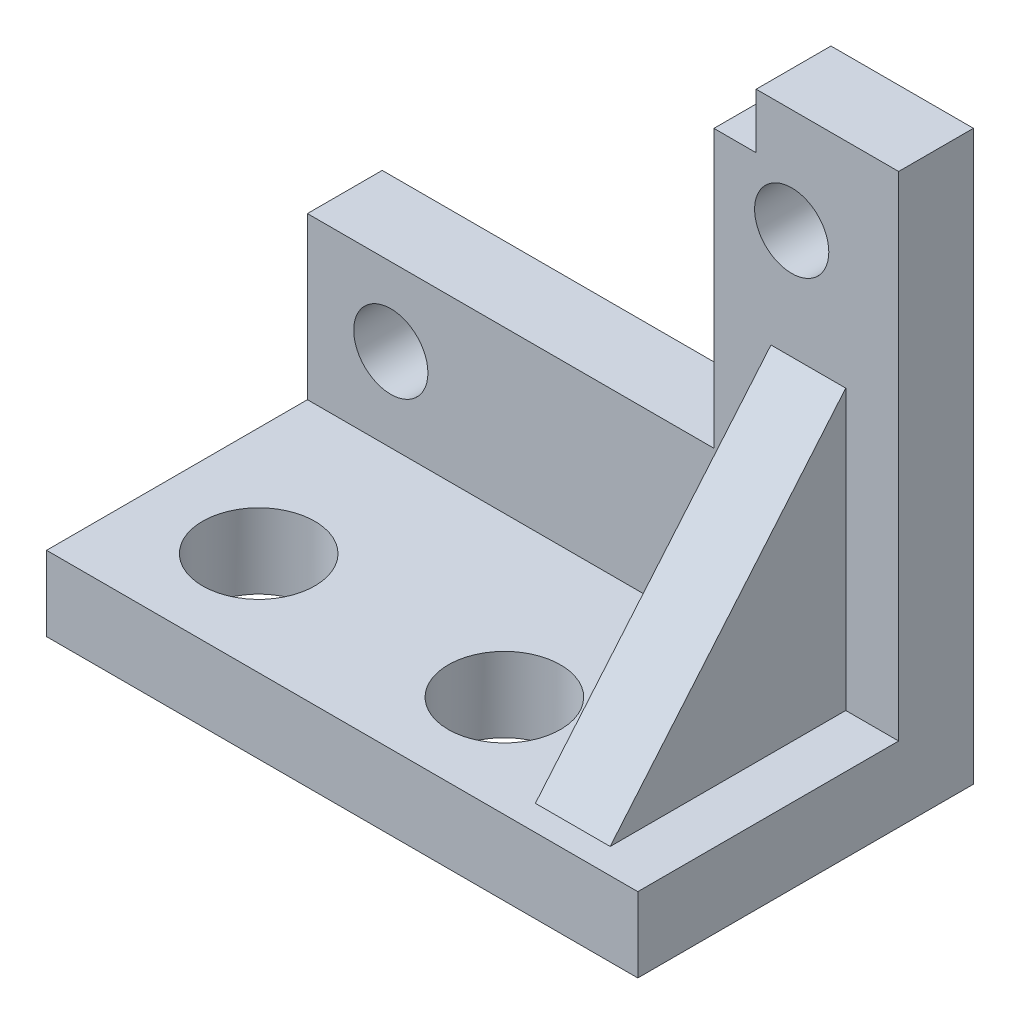
ISO-10303-21;
HEADER;
FILE_DESCRIPTION(('STEP AP214'),'2;1');
FILE_NAME('part.step','',(''),(''),'','','');
FILE_SCHEMA(('AUTOMOTIVE_DESIGN { 1 0 10303 214 1 1 1 1 }'));
ENDSEC;
DATA;
#1=APPLICATION_CONTEXT('core data for automotive mechanical design processes');
#2=APPLICATION_PROTOCOL_DEFINITION('international standard','automotive_design',2000,#1);
#3=PRODUCT_CONTEXT('',#1,'mechanical');
#4=PRODUCT('Part','Part','',(#3));
#5=PRODUCT_RELATED_PRODUCT_CATEGORY('part','',(#4));
#6=PRODUCT_DEFINITION_FORMATION('','',#4);
#7=PRODUCT_DEFINITION_CONTEXT('part definition',#1,'design');
#8=PRODUCT_DEFINITION('design','',#6,#7);
#9=PRODUCT_DEFINITION_SHAPE('','',#8);
#10=(LENGTH_UNIT() NAMED_UNIT(*) SI_UNIT(.MILLI.,.METRE.));
#11=(NAMED_UNIT(*) PLANE_ANGLE_UNIT() SI_UNIT($,.RADIAN.));
#12=(NAMED_UNIT(*) SI_UNIT($,.STERADIAN.) SOLID_ANGLE_UNIT());
#13=UNCERTAINTY_MEASURE_WITH_UNIT(LENGTH_MEASURE(1.E-05),#10,'distance_accuracy_value','');
#14=(GEOMETRIC_REPRESENTATION_CONTEXT(3) GLOBAL_UNCERTAINTY_ASSIGNED_CONTEXT((#13)) GLOBAL_UNIT_ASSIGNED_CONTEXT((#10,
#11,#12)) REPRESENTATION_CONTEXT('',''));
#15=CARTESIAN_POINT('',(0.,0.,0.));
#16=DIRECTION('',(0.,0.,1.));
#17=DIRECTION('',(1.,0.,0.));
#18=AXIS2_PLACEMENT_3D('',#15,#16,#17);
#19=CARTESIAN_POINT('',(12.2372138290052,-8.28040490381666,19.05));
#20=DIRECTION('',(0.,1.,0.));
#21=DIRECTION('',(0.,0.,1.));
#22=AXIS2_PLACEMENT_3D('',#19,#20,#21);
#23=PLANE('',#22);
#24=CARTESIAN_POINT('',(2.25586703304267,-8.28040490381666,9.93045378198823));
#25=DIRECTION('',(0.,1.,0.));
#26=DIRECTION('',(0.,0.,1.));
#27=AXIS2_PLACEMENT_3D('',#24,#25,#26);
#28=CIRCLE('',#27,2.38125);
#29=CARTESIAN_POINT('',(2.25586703304267,-8.28040490381666,12.3117037819882));
#30=VERTEX_POINT('',#29);
#31=EDGE_CURVE('E211',#30,#30,#28,.T.);
#32=ORIENTED_EDGE('',*,*,#31,.F.);
#33=EDGE_LOOP('',(#32));
#34=FACE_BOUND('',#33,.T.);
#35=CARTESIAN_POINT('',(-8.23667785925595,-8.28040490381666,9.86728065063617));
#36=DIRECTION('',(0.,1.,0.));
#37=DIRECTION('',(0.,0.,1.));
#38=AXIS2_PLACEMENT_3D('',#35,#36,#37);
#39=CIRCLE('',#38,2.38125);
#40=CARTESIAN_POINT('',(-8.23667785925595,-8.28040490381666,12.2485306506362));
#41=VERTEX_POINT('',#40);
#42=EDGE_CURVE('E202',#41,#41,#39,.T.);
#43=ORIENTED_EDGE('',*,*,#42,.F.);
#44=EDGE_LOOP('',(#43));
#45=FACE_BOUND('',#44,.T.);
#46=DIRECTION('',(0.,0.,1.));
#47=VECTOR('',#46,1.);
#48=CARTESIAN_POINT('',(-12.8607861709948,-8.28040490381666,0.));
#49=LINE('',#48,#47);
#50=CARTESIAN_POINT('',(-12.8607861709948,-8.28040490381666,3.175));
#51=VERTEX_POINT('',#50);
#52=CARTESIAN_POINT('',(-12.8607861709948,-8.28040490381666,14.2485306506362));
#53=VERTEX_POINT('',#52);
#54=EDGE_CURVE('E210',#51,#53,#49,.T.);
#55=ORIENTED_EDGE('',*,*,#54,.T.);
#56=DIRECTION('',(1.,0.,0.));
#57=VECTOR('',#56,1.);
#58=CARTESIAN_POINT('',(0.,-8.28040490381666,14.2485306506362));
#59=LINE('',#58,#57);
#60=CARTESIAN_POINT('',(12.2372138290052,-8.28040490381666,14.2485306506362));
#61=VERTEX_POINT('',#60);
#62=EDGE_CURVE('E118',#53,#61,#59,.T.);
#63=ORIENTED_EDGE('',*,*,#62,.T.);
#64=DIRECTION('',(0.,0.,-1.));
#65=VECTOR('',#64,1.);
#66=CARTESIAN_POINT('',(12.2372138290052,-8.28040490381666,19.05));
#67=LINE('',#66,#65);
#68=CARTESIAN_POINT('',(12.2372138290052,-8.28040490381666,3.175));
#69=VERTEX_POINT('',#68);
#70=EDGE_CURVE('E207',#61,#69,#67,.T.);
#71=ORIENTED_EDGE('',*,*,#70,.T.);
#72=DIRECTION('',(1.,0.,0.));
#73=VECTOR('',#72,1.);
#74=CARTESIAN_POINT('',(-11.8607861709948,-8.28040490381666,3.175));
#75=LINE('',#74,#73);
#76=CARTESIAN_POINT('',(9.99150883570193,-8.28040490381666,3.175));
#77=VERTEX_POINT('',#76);
#78=EDGE_CURVE('E239',#77,#69,#75,.T.);
#79=ORIENTED_EDGE('',*,*,#78,.F.);
#80=DIRECTION('',(0.,0.,-1.));
#81=VECTOR('',#80,1.);
#82=CARTESIAN_POINT('',(9.99150883570193,-8.28040490381666,13.175));
#83=LINE('',#82,#81);
#84=CARTESIAN_POINT('',(9.99150883570193,-8.28040490381666,13.175));
#85=VERTEX_POINT('',#84);
#86=EDGE_CURVE('E298',#85,#77,#83,.T.);
#87=ORIENTED_EDGE('',*,*,#86,.F.);
#88=DIRECTION('',(1.,0.,0.));
#89=VECTOR('',#88,1.);
#90=CARTESIAN_POINT('',(6.81650883570193,-8.28040490381666,13.175));
#91=LINE('',#90,#89);
#92=CARTESIAN_POINT('',(6.81650883570193,-8.28040490381666,13.175));
#93=VERTEX_POINT('',#92);
#94=EDGE_CURVE('E296',#93,#85,#91,.T.);
#95=ORIENTED_EDGE('',*,*,#94,.F.);
#96=DIRECTION('',(0.,0.,-1.));
#97=VECTOR('',#96,1.);
#98=CARTESIAN_POINT('',(6.81650883570193,-8.28040490381666,13.175));
#99=LINE('',#98,#97);
#100=CARTESIAN_POINT('',(6.81650883570193,-8.28040490381666,3.175));
#101=VERTEX_POINT('',#100);
#102=EDGE_CURVE('E308',#93,#101,#99,.T.);
#103=ORIENTED_EDGE('',*,*,#102,.T.);
#104=EDGE_CURVE('E236',#51,#101,#75,.T.);
#105=ORIENTED_EDGE('',*,*,#104,.F.);
#106=EDGE_LOOP('',(#55,#63,#71,#79,#87,#95,#103,#105));
#107=FACE_BOUND('',#106,.T.);
#108=ADVANCED_FACE('F101',(#34,#45,#107),#23,.T.);
#109=CARTESIAN_POINT('',(12.2372138290052,-8.28040490381666,3.175));
#110=DIRECTION('',(-1.,0.,0.));
#111=DIRECTION('',(0.,0.,1.));
#112=AXIS2_PLACEMENT_3D('',#109,#110,#111);
#113=PLANE('',#112);
#114=DIRECTION('',(0.,1.,0.));
#115=VECTOR('',#114,1.);
#116=CARTESIAN_POINT('',(12.2372138290052,-18.2804049038167,14.2485306506362));
#117=LINE('',#116,#115);
#118=CARTESIAN_POINT('',(12.2372138290052,-11.4554049038167,14.2485306506362));
#119=VERTEX_POINT('',#118);
#120=EDGE_CURVE('E195',#119,#61,#117,.T.);
#121=ORIENTED_EDGE('',*,*,#120,.F.);
#122=DIRECTION('',(0.,0.,-1.));
#123=VECTOR('',#122,1.);
#124=CARTESIAN_POINT('',(12.2372138290052,-11.4554049038167,19.05));
#125=LINE('',#124,#123);
#126=CARTESIAN_POINT('',(12.2372138290052,-11.4554049038167,0.));
#127=VERTEX_POINT('',#126);
#128=EDGE_CURVE('E217',#119,#127,#125,.T.);
#129=ORIENTED_EDGE('',*,*,#128,.T.);
#130=DIRECTION('',(0.,1.,0.));
#131=VECTOR('',#130,1.);
#132=CARTESIAN_POINT('',(12.2372138290052,-8.28040490381666,0.));
#133=LINE('',#132,#131);
#134=CARTESIAN_POINT('',(12.2372138290052,12.6585950961833,0.));
#135=VERTEX_POINT('',#134);
#136=EDGE_CURVE('E233',#127,#135,#133,.T.);
#137=ORIENTED_EDGE('',*,*,#136,.T.);
#138=DIRECTION('',(0.,0.,-1.));
#139=VECTOR('',#138,1.);
#140=CARTESIAN_POINT('',(12.2372138290052,12.6585950961833,3.175));
#141=LINE('',#140,#139);
#142=CARTESIAN_POINT('',(12.2372138290052,12.6585950961833,3.175));
#143=VERTEX_POINT('',#142);
#144=EDGE_CURVE('E110',#143,#135,#141,.T.);
#145=ORIENTED_EDGE('',*,*,#144,.F.);
#146=DIRECTION('',(0.,1.,0.));
#147=VECTOR('',#146,1.);
#148=CARTESIAN_POINT('',(12.2372138290052,-8.28040490381666,3.175));
#149=LINE('',#148,#147);
#150=EDGE_CURVE('E215',#69,#143,#149,.T.);
#151=ORIENTED_EDGE('',*,*,#150,.F.);
#152=ORIENTED_EDGE('',*,*,#70,.F.);
#153=EDGE_LOOP('',(#121,#129,#137,#145,#151,#152));
#154=FACE_BOUND('',#153,.T.);
#155=ADVANCED_FACE('F103',(#154),#113,.F.);
#156=CARTESIAN_POINT('',(12.2372138290052,-11.4554049038167,19.05));
#157=DIRECTION('',(0.,-1.,0.));
#158=DIRECTION('',(0.,0.,-1.));
#159=AXIS2_PLACEMENT_3D('',#156,#157,#158);
#160=PLANE('',#159);
#161=CARTESIAN_POINT('',(2.25586703304267,-11.4554049038167,9.93045378198823));
#162=DIRECTION('',(0.,-1.,0.));
#163=DIRECTION('',(0.,0.,-1.));
#164=AXIS2_PLACEMENT_3D('',#161,#162,#163);
#165=CIRCLE('',#164,2.38125);
#166=CARTESIAN_POINT('',(2.25586703304267,-11.4554049038167,7.54920378198822));
#167=VERTEX_POINT('',#166);
#168=EDGE_CURVE('E105',#167,#167,#165,.T.);
#169=ORIENTED_EDGE('',*,*,#168,.F.);
#170=EDGE_LOOP('',(#169));
#171=FACE_BOUND('',#170,.T.);
#172=CARTESIAN_POINT('',(-8.23667785925595,-11.4554049038167,9.86728065063617));
#173=DIRECTION('',(0.,-1.,0.));
#174=DIRECTION('',(0.,0.,-1.));
#175=AXIS2_PLACEMENT_3D('',#172,#173,#174);
#176=CIRCLE('',#175,2.38125);
#177=CARTESIAN_POINT('',(-8.23667785925595,-11.4554049038167,7.48603065063617));
#178=VERTEX_POINT('',#177);
#179=EDGE_CURVE('E279',#178,#178,#176,.T.);
#180=ORIENTED_EDGE('',*,*,#179,.F.);
#181=EDGE_LOOP('',(#180));
#182=FACE_BOUND('',#181,.T.);
#183=ORIENTED_EDGE('',*,*,#128,.F.);
#184=DIRECTION('',(-1.,0.,0.));
#185=VECTOR('',#184,1.);
#186=CARTESIAN_POINT('',(12.2372138290052,-11.4554049038167,14.2485306506362));
#187=LINE('',#186,#185);
#188=CARTESIAN_POINT('',(-12.8607861709948,-11.4554049038167,14.2485306506362));
#189=VERTEX_POINT('',#188);
#190=EDGE_CURVE('E198',#119,#189,#187,.T.);
#191=ORIENTED_EDGE('',*,*,#190,.T.);
#192=DIRECTION('',(0.,0.,1.));
#193=VECTOR('',#192,1.);
#194=CARTESIAN_POINT('',(-12.8607861709948,-11.4554049038167,0.));
#195=LINE('',#194,#193);
#196=CARTESIAN_POINT('',(-12.8607861709948,-11.4554049038167,0.));
#197=VERTEX_POINT('',#196);
#198=EDGE_CURVE('E310',#197,#189,#195,.T.);
#199=ORIENTED_EDGE('',*,*,#198,.F.);
#200=DIRECTION('',(-1.,0.,0.));
#201=VECTOR('',#200,1.);
#202=CARTESIAN_POINT('',(12.2372138290052,-11.4554049038167,0.));
#203=LINE('',#202,#201);
#204=EDGE_CURVE('E222',#127,#197,#203,.T.);
#205=ORIENTED_EDGE('',*,*,#204,.F.);
#206=EDGE_LOOP('',(#183,#191,#199,#205));
#207=FACE_BOUND('',#206,.T.);
#208=ADVANCED_FACE('F333',(#171,#182,#207),#160,.T.);
#209=CARTESIAN_POINT('',(-12.8607861709948,-1.43840490381666,0.));
#210=DIRECTION('',(-1.,0.,0.));
#211=DIRECTION('',(0.,-1.,0.));
#212=AXIS2_PLACEMENT_3D('',#209,#210,#211);
#213=PLANE('',#212);
#214=ORIENTED_EDGE('',*,*,#198,.T.);
#215=DIRECTION('',(0.,1.,0.));
#216=VECTOR('',#215,1.);
#217=CARTESIAN_POINT('',(-12.8607861709948,-1.43840490381666,14.2485306506362));
#218=LINE('',#217,#216);
#219=EDGE_CURVE('E12',#189,#53,#218,.T.);
#220=ORIENTED_EDGE('',*,*,#219,.T.);
#221=ORIENTED_EDGE('',*,*,#54,.F.);
#222=DIRECTION('',(0.,-1.,0.));
#223=VECTOR('',#222,1.);
#224=CARTESIAN_POINT('',(-12.8607861709948,-1.43840490381666,3.175));
#225=LINE('',#224,#223);
#226=CARTESIAN_POINT('',(-12.8607861709948,-1.43840490381666,3.175));
#227=VERTEX_POINT('',#226);
#228=EDGE_CURVE('E312',#227,#51,#225,.T.);
#229=ORIENTED_EDGE('',*,*,#228,.F.);
#230=DIRECTION('',(0.,0.,1.));
#231=VECTOR('',#230,1.);
#232=CARTESIAN_POINT('',(-12.8607861709948,-1.43840490381666,0.));
#233=LINE('',#232,#231);
#234=CARTESIAN_POINT('',(-12.8607861709948,-1.43840490381666,0.));
#235=VERTEX_POINT('',#234);
#236=EDGE_CURVE('E317',#235,#227,#233,.T.);
#237=ORIENTED_EDGE('',*,*,#236,.F.);
#238=DIRECTION('',(0.,-1.,0.));
#239=VECTOR('',#238,1.);
#240=CARTESIAN_POINT('',(-12.8607861709948,-1.43840490381666,0.));
#241=LINE('',#240,#239);
#242=EDGE_CURVE('E314',#235,#197,#241,.T.);
#243=ORIENTED_EDGE('',*,*,#242,.T.);
#244=EDGE_LOOP('',(#214,#220,#221,#229,#237,#243));
#245=FACE_BOUND('',#244,.T.);
#246=ADVANCED_FACE('F332',(#245),#213,.T.);
#247=CARTESIAN_POINT('',(0.,0.,3.175));
#248=DIRECTION('',(0.,0.,1.));
#249=DIRECTION('',(1.,0.,0.));
#250=AXIS2_PLACEMENT_3D('',#247,#248,#249);
#251=PLANE('',#250);
#252=DIRECTION('',(0.,-1.,0.));
#253=VECTOR('',#252,1.);
#254=CARTESIAN_POINT('',(6.81650883570193,3.57002461571214,3.175));
#255=LINE('',#254,#253);
#256=CARTESIAN_POINT('',(6.81650883570193,3.57002461571214,3.175));
#257=VERTEX_POINT('',#256);
#258=EDGE_CURVE('E295',#257,#101,#255,.T.);
#259=ORIENTED_EDGE('',*,*,#258,.F.);
#260=DIRECTION('',(-1.,0.,0.));
#261=VECTOR('',#260,1.);
#262=CARTESIAN_POINT('',(9.99150883570193,3.57002461571214,3.175));
#263=LINE('',#262,#261);
#264=CARTESIAN_POINT('',(9.99150883570193,3.57002461571214,3.175));
#265=VERTEX_POINT('',#264);
#266=EDGE_CURVE('E299',#265,#257,#263,.T.);
#267=ORIENTED_EDGE('',*,*,#266,.F.);
#268=DIRECTION('',(0.,1.,0.));
#269=VECTOR('',#268,1.);
#270=CARTESIAN_POINT('',(9.99150883570193,-8.28040490381666,3.175));
#271=LINE('',#270,#269);
#272=EDGE_CURVE('E302',#77,#265,#271,.T.);
#273=ORIENTED_EDGE('',*,*,#272,.F.);
#274=ORIENTED_EDGE('',*,*,#78,.T.);
#275=ORIENTED_EDGE('',*,*,#150,.T.);
#276=DIRECTION('',(-1.,0.,0.));
#277=VECTOR('',#276,1.);
#278=CARTESIAN_POINT('',(12.2372138290052,12.6585950961833,3.175));
#279=LINE('',#278,#277);
#280=CARTESIAN_POINT('',(6.18817038186677,12.6585950961833,3.175));
#281=VERTEX_POINT('',#280);
#282=EDGE_CURVE('E241',#143,#281,#279,.T.);
#283=ORIENTED_EDGE('',*,*,#282,.T.);
#284=DIRECTION('',(0.,1.,0.));
#285=VECTOR('',#284,1.);
#286=CARTESIAN_POINT('',(6.18817038186677,10.3218119533511,3.175));
#287=LINE('',#286,#285);
#288=CARTESIAN_POINT('',(6.18817038186677,10.3218119533511,3.175));
#289=VERTEX_POINT('',#288);
#290=EDGE_CURVE('E243',#289,#281,#287,.T.);
#291=ORIENTED_EDGE('',*,*,#290,.F.);
#292=DIRECTION('',(1.,0.,0.));
#293=VECTOR('',#292,1.);
#294=CARTESIAN_POINT('',(4.39521382900517,10.3218119533511,3.175));
#295=LINE('',#294,#293);
#296=CARTESIAN_POINT('',(4.39521382900517,10.3218119533511,3.175));
#297=VERTEX_POINT('',#296);
#298=EDGE_CURVE('E246',#297,#289,#295,.T.);
#299=ORIENTED_EDGE('',*,*,#298,.F.);
#300=DIRECTION('',(0.,-1.,0.));
#301=VECTOR('',#300,1.);
#302=CARTESIAN_POINT('',(4.39521382900517,10.3218119533511,3.175));
#303=LINE('',#302,#301);
#304=CARTESIAN_POINT('',(4.39521382900517,-1.43840490381666,3.175));
#305=VERTEX_POINT('',#304);
#306=EDGE_CURVE('E249',#297,#305,#303,.T.);
#307=ORIENTED_EDGE('',*,*,#306,.T.);
#308=DIRECTION('',(-1.,0.,0.));
#309=VECTOR('',#308,1.);
#310=CARTESIAN_POINT('',(4.39521382900517,-1.43840490381666,3.175));
#311=LINE('',#310,#309);
#312=EDGE_CURVE('E251',#305,#227,#311,.T.);
#313=ORIENTED_EDGE('',*,*,#312,.T.);
#314=ORIENTED_EDGE('',*,*,#228,.T.);
#315=ORIENTED_EDGE('',*,*,#104,.T.);
#316=EDGE_LOOP('',(#259,#267,#273,#274,#275,#283,#291,#299,#307,#313,#314,#315));
#317=FACE_BOUND('',#316,.T.);
#318=CARTESIAN_POINT('',(-9.32078617099483,-4.74040490381666,3.175));
#319=DIRECTION('',(0.,0.,1.));
#320=DIRECTION('',(1.,0.,0.));
#321=AXIS2_PLACEMENT_3D('',#318,#319,#320);
#322=CIRCLE('',#321,1.5748);
#323=CARTESIAN_POINT('',(-7.74598617099483,-4.74040490381666,3.175));
#324=VERTEX_POINT('',#323);
#325=EDGE_CURVE('E220',#324,#324,#322,.T.);
#326=ORIENTED_EDGE('',*,*,#325,.F.);
#327=EDGE_LOOP('',(#326));
#328=FACE_BOUND('',#327,.T.);
#329=CARTESIAN_POINT('',(7.69721382900516,8.21359509618334,3.175));
#330=DIRECTION('',(0.,0.,1.));
#331=DIRECTION('',(1.,0.,0.));
#332=AXIS2_PLACEMENT_3D('',#329,#330,#331);
#333=CIRCLE('',#332,1.5748);
#334=CARTESIAN_POINT('',(9.27201382900516,8.21359509618334,3.175));
#335=VERTEX_POINT('',#334);
#336=EDGE_CURVE('E230',#335,#335,#333,.T.);
#337=ORIENTED_EDGE('',*,*,#336,.F.);
#338=EDGE_LOOP('',(#337));
#339=FACE_BOUND('',#338,.T.);
#340=ADVANCED_FACE('F341',(#317,#328,#339),#251,.T.);
#341=CARTESIAN_POINT('',(0.,0.,0.));
#342=DIRECTION('',(0.,0.,1.));
#343=DIRECTION('',(1.,0.,0.));
#344=AXIS2_PLACEMENT_3D('',#341,#342,#343);
#345=PLANE('',#344);
#346=ORIENTED_EDGE('',*,*,#204,.T.);
#347=ORIENTED_EDGE('',*,*,#242,.F.);
#348=DIRECTION('',(-1.,0.,0.));
#349=VECTOR('',#348,1.);
#350=CARTESIAN_POINT('',(4.39521382900517,-1.43840490381666,0.));
#351=LINE('',#350,#349);
#352=CARTESIAN_POINT('',(4.39521382900517,-1.43840490381666,0.));
#353=VERTEX_POINT('',#352);
#354=EDGE_CURVE('E267',#353,#235,#351,.T.);
#355=ORIENTED_EDGE('',*,*,#354,.F.);
#356=DIRECTION('',(0.,-1.,0.));
#357=VECTOR('',#356,1.);
#358=CARTESIAN_POINT('',(4.39521382900517,7.82738812093123,0.));
#359=LINE('',#358,#357);
#360=CARTESIAN_POINT('',(4.39521382900517,10.3218119533511,0.));
#361=VERTEX_POINT('',#360);
#362=EDGE_CURVE('E265',#361,#353,#359,.T.);
#363=ORIENTED_EDGE('',*,*,#362,.F.);
#364=DIRECTION('',(1.,0.,0.));
#365=VECTOR('',#364,1.);
#366=CARTESIAN_POINT('',(4.39521382900517,10.3218119533511,0.));
#367=LINE('',#366,#365);
#368=CARTESIAN_POINT('',(6.18817038186677,10.3218119533511,0.));
#369=VERTEX_POINT('',#368);
#370=EDGE_CURVE('E262',#361,#369,#367,.T.);
#371=ORIENTED_EDGE('',*,*,#370,.T.);
#372=DIRECTION('',(0.,1.,0.));
#373=VECTOR('',#372,1.);
#374=CARTESIAN_POINT('',(6.18817038186677,10.3218119533511,0.));
#375=LINE('',#374,#373);
#376=CARTESIAN_POINT('',(6.18817038186677,12.6585950961833,0.));
#377=VERTEX_POINT('',#376);
#378=EDGE_CURVE('E259',#369,#377,#375,.T.);
#379=ORIENTED_EDGE('',*,*,#378,.T.);
#380=DIRECTION('',(-1.,0.,0.));
#381=VECTOR('',#380,1.);
#382=CARTESIAN_POINT('',(7.69721382900516,12.6585950961833,0.));
#383=LINE('',#382,#381);
#384=EDGE_CURVE('E256',#135,#377,#383,.T.);
#385=ORIENTED_EDGE('',*,*,#384,.F.);
#386=ORIENTED_EDGE('',*,*,#136,.F.);
#387=EDGE_LOOP('',(#346,#347,#355,#363,#371,#379,#385,#386));
#388=FACE_BOUND('',#387,.T.);
#389=CARTESIAN_POINT('',(7.69721382900516,8.21359509618334,0.));
#390=DIRECTION('',(0.,0.,1.));
#391=DIRECTION('',(1.,0.,0.));
#392=AXIS2_PLACEMENT_3D('',#389,#390,#391);
#393=CIRCLE('',#392,1.5748);
#394=CARTESIAN_POINT('',(9.27201382900516,8.21359509618334,0.));
#395=VERTEX_POINT('',#394);
#396=EDGE_CURVE('E228',#395,#395,#393,.T.);
#397=ORIENTED_EDGE('',*,*,#396,.T.);
#398=EDGE_LOOP('',(#397));
#399=FACE_BOUND('',#398,.T.);
#400=CARTESIAN_POINT('',(-9.32078617099483,-4.74040490381666,0.));
#401=DIRECTION('',(0.,0.,1.));
#402=DIRECTION('',(1.,0.,0.));
#403=AXIS2_PLACEMENT_3D('',#400,#401,#402);
#404=CIRCLE('',#403,1.5748);
#405=CARTESIAN_POINT('',(-7.74598617099483,-4.74040490381666,0.));
#406=VERTEX_POINT('',#405);
#407=EDGE_CURVE('E216',#406,#406,#404,.T.);
#408=ORIENTED_EDGE('',*,*,#407,.T.);
#409=EDGE_LOOP('',(#408));
#410=FACE_BOUND('',#409,.T.);
#411=ADVANCED_FACE('F328',(#388,#399,#410),#345,.F.);
#412=CARTESIAN_POINT('',(7.69721382900516,12.6585950961833,3.175));
#413=DIRECTION('',(0.,-1.,0.));
#414=DIRECTION('',(1.,0.,0.));
#415=AXIS2_PLACEMENT_3D('',#412,#413,#414);
#416=PLANE('',#415);
#417=ORIENTED_EDGE('',*,*,#384,.T.);
#418=DIRECTION('',(0.,0.,-1.));
#419=VECTOR('',#418,1.);
#420=CARTESIAN_POINT('',(6.18817038186677,12.6585950961833,3.175));
#421=LINE('',#420,#419);
#422=EDGE_CURVE('E276',#281,#377,#421,.T.);
#423=ORIENTED_EDGE('',*,*,#422,.F.);
#424=ORIENTED_EDGE('',*,*,#282,.F.);
#425=ORIENTED_EDGE('',*,*,#144,.T.);
#426=EDGE_LOOP('',(#417,#423,#424,#425));
#427=FACE_BOUND('',#426,.T.);
#428=ADVANCED_FACE('F438',(#427),#416,.F.);
#429=CARTESIAN_POINT('',(6.18817038186677,10.3218119533511,3.175));
#430=DIRECTION('',(-1.,0.,0.));
#431=DIRECTION('',(0.,0.,1.));
#432=AXIS2_PLACEMENT_3D('',#429,#430,#431);
#433=PLANE('',#432);
#434=ORIENTED_EDGE('',*,*,#378,.F.);
#435=DIRECTION('',(0.,0.,-1.));
#436=VECTOR('',#435,1.);
#437=CARTESIAN_POINT('',(6.18817038186677,10.3218119533511,3.175));
#438=LINE('',#437,#436);
#439=EDGE_CURVE('E274',#289,#369,#438,.T.);
#440=ORIENTED_EDGE('',*,*,#439,.F.);
#441=ORIENTED_EDGE('',*,*,#290,.T.);
#442=ORIENTED_EDGE('',*,*,#422,.T.);
#443=EDGE_LOOP('',(#434,#440,#441,#442));
#444=FACE_BOUND('',#443,.T.);
#445=ADVANCED_FACE('F446',(#444),#433,.T.);
#446=CARTESIAN_POINT('',(4.39521382900517,10.3218119533511,3.175));
#447=DIRECTION('',(0.,1.,0.));
#448=DIRECTION('',(0.,0.,1.));
#449=AXIS2_PLACEMENT_3D('',#446,#447,#448);
#450=PLANE('',#449);
#451=ORIENTED_EDGE('',*,*,#370,.F.);
#452=DIRECTION('',(0.,0.,-1.));
#453=VECTOR('',#452,1.);
#454=CARTESIAN_POINT('',(4.39521382900517,10.3218119533511,3.175));
#455=LINE('',#454,#453);
#456=EDGE_CURVE('E271',#297,#361,#455,.T.);
#457=ORIENTED_EDGE('',*,*,#456,.F.);
#458=ORIENTED_EDGE('',*,*,#298,.T.);
#459=ORIENTED_EDGE('',*,*,#439,.T.);
#460=EDGE_LOOP('',(#451,#457,#458,#459));
#461=FACE_BOUND('',#460,.T.);
#462=ADVANCED_FACE('F453',(#461),#450,.T.);
#463=CARTESIAN_POINT('',(4.39521382900517,7.82738812093123,3.175));
#464=DIRECTION('',(1.,0.,0.));
#465=DIRECTION('',(0.,0.,-1.));
#466=AXIS2_PLACEMENT_3D('',#463,#464,#465);
#467=PLANE('',#466);
#468=ORIENTED_EDGE('',*,*,#362,.T.);
#469=DIRECTION('',(0.,0.,-1.));
#470=VECTOR('',#469,1.);
#471=CARTESIAN_POINT('',(4.39521382900517,-1.43840490381666,3.175));
#472=LINE('',#471,#470);
#473=EDGE_CURVE('E253',#305,#353,#472,.T.);
#474=ORIENTED_EDGE('',*,*,#473,.F.);
#475=ORIENTED_EDGE('',*,*,#306,.F.);
#476=ORIENTED_EDGE('',*,*,#456,.T.);
#477=EDGE_LOOP('',(#468,#474,#475,#476));
#478=FACE_BOUND('',#477,.T.);
#479=ADVANCED_FACE('F461',(#478),#467,.F.);
#480=CARTESIAN_POINT('',(4.39521382900517,-1.43840490381666,3.175));
#481=DIRECTION('',(0.,-1.,0.));
#482=DIRECTION('',(1.,0.,0.));
#483=AXIS2_PLACEMENT_3D('',#480,#481,#482);
#484=PLANE('',#483);
#485=ORIENTED_EDGE('',*,*,#354,.T.);
#486=ORIENTED_EDGE('',*,*,#236,.T.);
#487=ORIENTED_EDGE('',*,*,#312,.F.);
#488=ORIENTED_EDGE('',*,*,#473,.T.);
#489=EDGE_LOOP('',(#485,#486,#487,#488));
#490=FACE_BOUND('',#489,.T.);
#491=ADVANCED_FACE('F469',(#490),#484,.F.);
#492=CARTESIAN_POINT('',(7.69721382900516,8.21359509618334,3.175));
#493=DIRECTION('',(0.,0.,-1.));
#494=DIRECTION('',(-1.,0.,0.));
#495=AXIS2_PLACEMENT_3D('',#492,#493,#494);
#496=CYLINDRICAL_SURFACE('',#495,1.5748);
#497=ORIENTED_EDGE('',*,*,#336,.T.);
#498=EDGE_LOOP('',(#497));
#499=FACE_BOUND('',#498,.T.);
#500=ORIENTED_EDGE('',*,*,#396,.F.);
#501=EDGE_LOOP('',(#500));
#502=FACE_BOUND('',#501,.T.);
#503=ADVANCED_FACE('F477',(#499,#502),#496,.F.);
#504=CARTESIAN_POINT('',(-9.32078617099483,-4.74040490381666,3.175));
#505=DIRECTION('',(0.,0.,-1.));
#506=DIRECTION('',(-1.,0.,0.));
#507=AXIS2_PLACEMENT_3D('',#504,#505,#506);
#508=CYLINDRICAL_SURFACE('',#507,1.5748);
#509=ORIENTED_EDGE('',*,*,#325,.T.);
#510=EDGE_LOOP('',(#509));
#511=FACE_BOUND('',#510,.T.);
#512=ORIENTED_EDGE('',*,*,#407,.F.);
#513=EDGE_LOOP('',(#512));
#514=FACE_BOUND('',#513,.T.);
#515=ADVANCED_FACE('F358',(#511,#514),#508,.F.);
#516=CARTESIAN_POINT('',(6.81650883570193,3.57002461571214,13.175));
#517=DIRECTION('',(1.,0.,0.));
#518=DIRECTION('',(0.,1.,0.));
#519=AXIS2_PLACEMENT_3D('',#516,#517,#518);
#520=PLANE('',#519);
#521=ORIENTED_EDGE('',*,*,#102,.F.);
#522=DIRECTION('',(0.,0.764253336088259,-0.644916148253373));
#523=VECTOR('',#522,1.);
#524=CARTESIAN_POINT('',(6.81650883570193,-1.35876856228616,7.33416838277967));
#525=LINE('',#524,#523);
#526=EDGE_CURVE('E125',#93,#257,#525,.T.);
#527=ORIENTED_EDGE('',*,*,#526,.T.);
#528=ORIENTED_EDGE('',*,*,#258,.T.);
#529=EDGE_LOOP('',(#521,#527,#528));
#530=FACE_BOUND('',#529,.T.);
#531=ADVANCED_FACE('F354',(#530),#520,.F.);
#532=CARTESIAN_POINT('',(9.99150883570193,-8.28040490381666,13.175));
#533=DIRECTION('',(-1.,0.,0.));
#534=DIRECTION('',(0.,-1.,0.));
#535=AXIS2_PLACEMENT_3D('',#532,#533,#534);
#536=PLANE('',#535);
#537=ORIENTED_EDGE('',*,*,#272,.T.);
#538=DIRECTION('',(0.,0.764253336088259,-0.644916148253373));
#539=VECTOR('',#538,1.);
#540=CARTESIAN_POINT('',(9.99150883570193,3.57002461571214,3.175));
#541=LINE('',#540,#539);
#542=EDGE_CURVE('E284',#85,#265,#541,.T.);
#543=ORIENTED_EDGE('',*,*,#542,.F.);
#544=ORIENTED_EDGE('',*,*,#86,.T.);
#545=EDGE_LOOP('',(#537,#543,#544));
#546=FACE_BOUND('',#545,.T.);
#547=ADVANCED_FACE('F357',(#546),#536,.F.);
#548=CARTESIAN_POINT('',(-12.8607861709948,3.57002461571214,3.175));
#549=DIRECTION('',(0.,-0.644916148253373,-0.764253336088259));
#550=DIRECTION('',(0.,0.764253336088259,-0.644916148253373));
#551=AXIS2_PLACEMENT_3D('',#548,#549,#550);
#552=PLANE('',#551);
#553=ORIENTED_EDGE('',*,*,#94,.T.);
#554=ORIENTED_EDGE('',*,*,#542,.T.);
#555=ORIENTED_EDGE('',*,*,#266,.T.);
#556=ORIENTED_EDGE('',*,*,#526,.F.);
#557=EDGE_LOOP('',(#553,#554,#555,#556));
#558=FACE_BOUND('',#557,.T.);
#559=ADVANCED_FACE('F362',(#558),#552,.F.);
#560=CARTESIAN_POINT('',(0.,-18.2804049038167,14.2485306506362));
#561=DIRECTION('',(0.,0.,1.));
#562=DIRECTION('',(1.,0.,0.));
#563=AXIS2_PLACEMENT_3D('',#560,#561,#562);
#564=PLANE('',#563);
#565=ORIENTED_EDGE('',*,*,#120,.T.);
#566=ORIENTED_EDGE('',*,*,#62,.F.);
#567=ORIENTED_EDGE('',*,*,#219,.F.);
#568=ORIENTED_EDGE('',*,*,#190,.F.);
#569=EDGE_LOOP('',(#565,#566,#567,#568));
#570=FACE_BOUND('',#569,.T.);
#571=ADVANCED_FACE('F196',(#570),#564,.T.);
#572=CARTESIAN_POINT('',(-8.23667785925595,-18.2804049038167,9.86728065063617));
#573=DIRECTION('',(0.,1.,0.));
#574=DIRECTION('',(0.,0.,1.));
#575=AXIS2_PLACEMENT_3D('',#572,#573,#574);
#576=CYLINDRICAL_SURFACE('',#575,2.38125);
#577=ORIENTED_EDGE('',*,*,#179,.T.);
#578=EDGE_LOOP('',(#577));
#579=FACE_BOUND('',#578,.T.);
#580=ORIENTED_EDGE('',*,*,#42,.T.);
#581=EDGE_LOOP('',(#580));
#582=FACE_BOUND('',#581,.T.);
#583=ADVANCED_FACE('F366',(#579,#582),#576,.F.);
#584=CARTESIAN_POINT('',(2.25586703304267,-18.2804049038167,9.93045378198823));
#585=DIRECTION('',(0.,1.,0.));
#586=DIRECTION('',(0.,0.,1.));
#587=AXIS2_PLACEMENT_3D('',#584,#585,#586);
#588=CYLINDRICAL_SURFACE('',#587,2.38125);
#589=ORIENTED_EDGE('',*,*,#168,.T.);
#590=EDGE_LOOP('',(#589));
#591=FACE_BOUND('',#590,.T.);
#592=ORIENTED_EDGE('',*,*,#31,.T.);
#593=EDGE_LOOP('',(#592));
#594=FACE_BOUND('',#593,.T.);
#595=ADVANCED_FACE('F369',(#591,#594),#588,.F.);
#596=CLOSED_SHELL('',(#108,#155,#208,#246,#340,#411,#428,#445,#462,#479,#491,#503,#515,#531,
#547,#559,#571,#583,#595));
#597=MANIFOLD_SOLID_BREP('B2',#596);
#598=ADVANCED_BREP_SHAPE_REPRESENTATION('',(#18,#597),#14);
#599=SHAPE_DEFINITION_REPRESENTATION(#9,#598);
ENDSEC;
END-ISO-10303-21;
